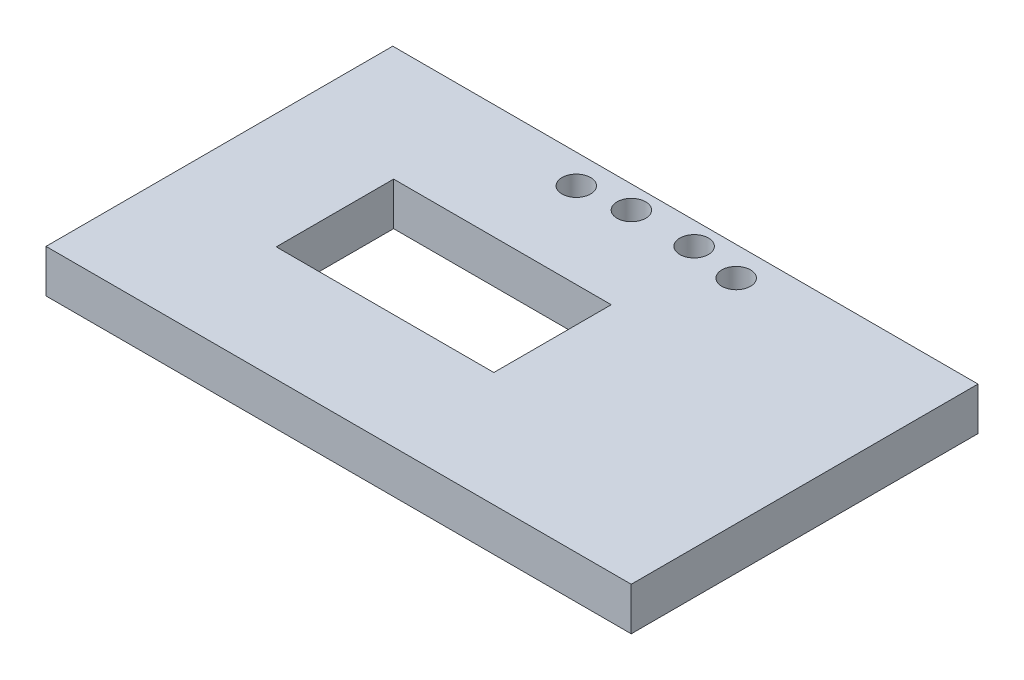
ISO-10303-21;
HEADER;
FILE_DESCRIPTION(('STEP AP214'),'2;1');
FILE_NAME('part.step','',(''),(''),'','','');
FILE_SCHEMA(('AUTOMOTIVE_DESIGN { 1 0 10303 214 1 1 1 1 }'));
ENDSEC;
DATA;
#1=APPLICATION_CONTEXT('core data for automotive mechanical design processes');
#2=APPLICATION_PROTOCOL_DEFINITION('international standard','automotive_design',2000,#1);
#3=PRODUCT_CONTEXT('',#1,'mechanical');
#4=PRODUCT('Part','Part','',(#3));
#5=PRODUCT_RELATED_PRODUCT_CATEGORY('part','',(#4));
#6=PRODUCT_DEFINITION_FORMATION('','',#4);
#7=PRODUCT_DEFINITION_CONTEXT('part definition',#1,'design');
#8=PRODUCT_DEFINITION('design','',#6,#7);
#9=PRODUCT_DEFINITION_SHAPE('','',#8);
#10=(LENGTH_UNIT() NAMED_UNIT(*) SI_UNIT(.MILLI.,.METRE.));
#11=(NAMED_UNIT(*) PLANE_ANGLE_UNIT() SI_UNIT($,.RADIAN.));
#12=(NAMED_UNIT(*) SI_UNIT($,.STERADIAN.) SOLID_ANGLE_UNIT());
#13=UNCERTAINTY_MEASURE_WITH_UNIT(LENGTH_MEASURE(1.E-05),#10,'distance_accuracy_value','');
#14=(GEOMETRIC_REPRESENTATION_CONTEXT(3) GLOBAL_UNCERTAINTY_ASSIGNED_CONTEXT((#13)) GLOBAL_UNIT_ASSIGNED_CONTEXT((#10,
#11,#12)) REPRESENTATION_CONTEXT('',''));
#15=CARTESIAN_POINT('',(0.,0.,0.));
#16=DIRECTION('',(0.,0.,1.));
#17=DIRECTION('',(1.,0.,0.));
#18=AXIS2_PLACEMENT_3D('',#15,#16,#17);
#19=CARTESIAN_POINT('',(0.,4.5,0.));
#20=DIRECTION('',(0.,-1.,0.));
#21=DIRECTION('',(0.,0.,-1.));
#22=AXIS2_PLACEMENT_3D('',#19,#20,#21);
#23=PLANE('',#22);
#24=CARTESIAN_POINT('',(-8.37556680298959,4.5,-15.1119633792668));
#25=DIRECTION('',(0.,1.,0.));
#26=DIRECTION('',(0.,0.,1.));
#27=AXIS2_PLACEMENT_3D('',#24,#25,#26);
#28=CIRCLE('',#27,1.5);
#29=CARTESIAN_POINT('',(-8.37556680298959,4.5,-13.6119633792668));
#30=VERTEX_POINT('',#29);
#31=EDGE_CURVE('E156',#30,#30,#28,.T.);
#32=ORIENTED_EDGE('',*,*,#31,.F.);
#33=EDGE_LOOP('',(#32));
#34=FACE_BOUND('',#33,.T.);
#35=DIRECTION('',(0.,0.,-1.));
#36=VECTOR('',#35,1.);
#37=CARTESIAN_POINT('',(30.6580366538147,4.5,18.1658847388471));
#38=LINE('',#37,#36);
#39=CARTESIAN_POINT('',(30.6580366538147,4.5,18.1658847388471));
#40=VERTEX_POINT('',#39);
#41=CARTESIAN_POINT('',(30.6580366538147,4.5,-18.1658847388471));
#42=VERTEX_POINT('',#41);
#43=EDGE_CURVE('E164',#40,#42,#38,.T.);
#44=ORIENTED_EDGE('',*,*,#43,.T.);
#45=DIRECTION('',(-1.,0.,0.));
#46=VECTOR('',#45,1.);
#47=CARTESIAN_POINT('',(-30.6580366538147,4.5,-18.1658847388471));
#48=LINE('',#47,#46);
#49=CARTESIAN_POINT('',(-30.6580366538147,4.5,-18.1658847388471));
#50=VERTEX_POINT('',#49);
#51=EDGE_CURVE('E168',#42,#50,#48,.T.);
#52=ORIENTED_EDGE('',*,*,#51,.T.);
#53=DIRECTION('',(0.,0.,1.));
#54=VECTOR('',#53,1.);
#55=CARTESIAN_POINT('',(-30.6580366538147,4.5,18.1658847388471));
#56=LINE('',#55,#54);
#57=CARTESIAN_POINT('',(-30.6580366538147,4.5,18.1658847388471));
#58=VERTEX_POINT('',#57);
#59=EDGE_CURVE('E172',#50,#58,#56,.T.);
#60=ORIENTED_EDGE('',*,*,#59,.T.);
#61=DIRECTION('',(1.,0.,0.));
#62=VECTOR('',#61,1.);
#63=CARTESIAN_POINT('',(-30.6580366538147,4.5,18.1658847388471));
#64=LINE('',#63,#62);
#65=EDGE_CURVE('E175',#58,#40,#64,.T.);
#66=ORIENTED_EDGE('',*,*,#65,.T.);
#67=EDGE_LOOP('',(#44,#52,#60,#66));
#68=FACE_BOUND('',#67,.T.);
#69=DIRECTION('',(0.,0.,1.));
#70=VECTOR('',#69,1.);
#71=CARTESIAN_POINT('',(-18.5521178849852,4.5,6.15));
#72=LINE('',#71,#70);
#73=CARTESIAN_POINT('',(-18.5521178849852,4.5,-6.15));
#74=VERTEX_POINT('',#73);
#75=CARTESIAN_POINT('',(-18.5521178849852,4.5,6.15));
#76=VERTEX_POINT('',#75);
#77=EDGE_CURVE('E105',#74,#76,#72,.T.);
#78=ORIENTED_EDGE('',*,*,#77,.F.);
#79=DIRECTION('',(-1.,0.,0.));
#80=VECTOR('',#79,1.);
#81=CARTESIAN_POINT('',(4.24788211501475,4.5,-6.15));
#82=LINE('',#81,#80);
#83=CARTESIAN_POINT('',(4.24788211501475,4.5,-6.15));
#84=VERTEX_POINT('',#83);
#85=EDGE_CURVE('E132',#84,#74,#82,.T.);
#86=ORIENTED_EDGE('',*,*,#85,.F.);
#87=DIRECTION('',(0.,0.,-1.));
#88=VECTOR('',#87,1.);
#89=CARTESIAN_POINT('',(4.24788211501476,4.5,6.15));
#90=LINE('',#89,#88);
#91=CARTESIAN_POINT('',(4.24788211501476,4.5,6.15));
#92=VERTEX_POINT('',#91);
#93=EDGE_CURVE('E128',#92,#84,#90,.T.);
#94=ORIENTED_EDGE('',*,*,#93,.F.);
#95=DIRECTION('',(1.,0.,0.));
#96=VECTOR('',#95,1.);
#97=CARTESIAN_POINT('',(4.24788211501476,4.5,6.15));
#98=LINE('',#97,#96);
#99=EDGE_CURVE('E114',#76,#92,#98,.T.);
#100=ORIENTED_EDGE('',*,*,#99,.F.);
#101=EDGE_LOOP('',(#78,#86,#94,#100));
#102=FACE_BOUND('',#101,.T.);
#103=CARTESIAN_POINT('',(-3.28811928008262,4.5,-15.7960495125027));
#104=DIRECTION('',(0.,1.,0.));
#105=DIRECTION('',(0.,0.,1.));
#106=AXIS2_PLACEMENT_3D('',#103,#104,#105);
#107=CIRCLE('',#106,1.5);
#108=CARTESIAN_POINT('',(-3.28811928008262,4.5,-14.2960495125027));
#109=VERTEX_POINT('',#108);
#110=EDGE_CURVE('E140',#109,#109,#107,.T.);
#111=ORIENTED_EDGE('',*,*,#110,.F.);
#112=EDGE_LOOP('',(#111));
#113=FACE_BOUND('',#112,.T.);
#114=CARTESIAN_POINT('',(3.28811928008262,4.5,-15.7960495125027));
#115=DIRECTION('',(0.,1.,0.));
#116=DIRECTION('',(0.,0.,-1.));
#117=AXIS2_PLACEMENT_3D('',#114,#115,#116);
#118=CIRCLE('',#117,1.5);
#119=CARTESIAN_POINT('',(3.28811928008262,4.5,-17.2960495125027));
#120=VERTEX_POINT('',#119);
#121=EDGE_CURVE('E288',#120,#120,#118,.T.);
#122=ORIENTED_EDGE('',*,*,#121,.F.);
#123=EDGE_LOOP('',(#122));
#124=FACE_BOUND('',#123,.T.);
#125=CARTESIAN_POINT('',(8.37556680298959,4.5,-15.1119633792668));
#126=DIRECTION('',(0.,1.,0.));
#127=DIRECTION('',(0.,0.,-1.));
#128=AXIS2_PLACEMENT_3D('',#125,#126,#127);
#129=CIRCLE('',#128,1.5);
#130=CARTESIAN_POINT('',(8.37556680298959,4.5,-16.6119633792668));
#131=VERTEX_POINT('',#130);
#132=EDGE_CURVE('E277',#131,#131,#129,.T.);
#133=ORIENTED_EDGE('',*,*,#132,.F.);
#134=EDGE_LOOP('',(#133));
#135=FACE_BOUND('',#134,.T.);
#136=ADVANCED_FACE('F39',(#34,#68,#102,#113,#124,#135),#23,.F.);
#137=CARTESIAN_POINT('',(0.,0.,0.));
#138=DIRECTION('',(0.,-1.,0.));
#139=DIRECTION('',(0.,0.,-1.));
#140=AXIS2_PLACEMENT_3D('',#137,#138,#139);
#141=PLANE('',#140);
#142=CARTESIAN_POINT('',(3.28811928008262,0.,-15.7960495125027));
#143=DIRECTION('',(0.,1.,0.));
#144=DIRECTION('',(0.,0.,-1.));
#145=AXIS2_PLACEMENT_3D('',#142,#143,#144);
#146=CIRCLE('',#145,1.5);
#147=CARTESIAN_POINT('',(3.28811928008262,0.,-17.2960495125027));
#148=VERTEX_POINT('',#147);
#149=EDGE_CURVE('E285',#148,#148,#146,.T.);
#150=ORIENTED_EDGE('',*,*,#149,.T.);
#151=EDGE_LOOP('',(#150));
#152=FACE_BOUND('',#151,.T.);
#153=DIRECTION('',(-1.,0.,0.));
#154=VECTOR('',#153,1.);
#155=CARTESIAN_POINT('',(4.24788211501475,0.,-6.15));
#156=LINE('',#155,#154);
#157=CARTESIAN_POINT('',(4.24788211501475,0.,-6.15));
#158=VERTEX_POINT('',#157);
#159=CARTESIAN_POINT('',(-18.5521178849852,0.,-6.15));
#160=VERTEX_POINT('',#159);
#161=EDGE_CURVE('E115',#158,#160,#156,.T.);
#162=ORIENTED_EDGE('',*,*,#161,.T.);
#163=DIRECTION('',(0.,0.,1.));
#164=VECTOR('',#163,1.);
#165=CARTESIAN_POINT('',(-18.5521178849852,0.,6.15));
#166=LINE('',#165,#164);
#167=CARTESIAN_POINT('',(-18.5521178849852,0.,6.15));
#168=VERTEX_POINT('',#167);
#169=EDGE_CURVE('E63',#160,#168,#166,.T.);
#170=ORIENTED_EDGE('',*,*,#169,.T.);
#171=DIRECTION('',(1.,0.,0.));
#172=VECTOR('',#171,1.);
#173=CARTESIAN_POINT('',(4.24788211501476,0.,6.15));
#174=LINE('',#173,#172);
#175=CARTESIAN_POINT('',(4.24788211501476,0.,6.15));
#176=VERTEX_POINT('',#175);
#177=EDGE_CURVE('E121',#168,#176,#174,.T.);
#178=ORIENTED_EDGE('',*,*,#177,.T.);
#179=DIRECTION('',(0.,0.,-1.));
#180=VECTOR('',#179,1.);
#181=CARTESIAN_POINT('',(4.24788211501476,0.,6.15));
#182=LINE('',#181,#180);
#183=EDGE_CURVE('E143',#176,#158,#182,.T.);
#184=ORIENTED_EDGE('',*,*,#183,.T.);
#185=EDGE_LOOP('',(#162,#170,#178,#184));
#186=FACE_BOUND('',#185,.T.);
#187=CARTESIAN_POINT('',(-8.37556680298959,0.,-15.1119633792668));
#188=DIRECTION('',(0.,1.,0.));
#189=DIRECTION('',(0.,0.,1.));
#190=AXIS2_PLACEMENT_3D('',#187,#188,#189);
#191=CIRCLE('',#190,1.5);
#192=CARTESIAN_POINT('',(-8.37556680298959,0.,-13.6119633792668));
#193=VERTEX_POINT('',#192);
#194=EDGE_CURVE('E123',#193,#193,#191,.T.);
#195=ORIENTED_EDGE('',*,*,#194,.T.);
#196=EDGE_LOOP('',(#195));
#197=FACE_BOUND('',#196,.T.);
#198=DIRECTION('',(0.,0.,-1.));
#199=VECTOR('',#198,1.);
#200=CARTESIAN_POINT('',(30.6580366538147,0.,18.1658847388471));
#201=LINE('',#200,#199);
#202=CARTESIAN_POINT('',(30.6580366538147,0.,18.1658847388471));
#203=VERTEX_POINT('',#202);
#204=CARTESIAN_POINT('',(30.6580366538147,0.,-18.1658847388471));
#205=VERTEX_POINT('',#204);
#206=EDGE_CURVE('E160',#203,#205,#201,.T.);
#207=ORIENTED_EDGE('',*,*,#206,.F.);
#208=DIRECTION('',(1.,0.,0.));
#209=VECTOR('',#208,1.);
#210=CARTESIAN_POINT('',(-30.6580366538147,0.,18.1658847388471));
#211=LINE('',#210,#209);
#212=CARTESIAN_POINT('',(-30.6580366538147,0.,18.1658847388471));
#213=VERTEX_POINT('',#212);
#214=EDGE_CURVE('E169',#213,#203,#211,.T.);
#215=ORIENTED_EDGE('',*,*,#214,.F.);
#216=DIRECTION('',(0.,0.,1.));
#217=VECTOR('',#216,1.);
#218=CARTESIAN_POINT('',(-30.6580366538147,0.,18.1658847388471));
#219=LINE('',#218,#217);
#220=CARTESIAN_POINT('',(-30.6580366538147,0.,-18.1658847388471));
#221=VERTEX_POINT('',#220);
#222=EDGE_CURVE('E185',#221,#213,#219,.T.);
#223=ORIENTED_EDGE('',*,*,#222,.F.);
#224=DIRECTION('',(-1.,0.,0.));
#225=VECTOR('',#224,1.);
#226=CARTESIAN_POINT('',(-30.6580366538147,0.,-18.1658847388471));
#227=LINE('',#226,#225);
#228=EDGE_CURVE('E182',#205,#221,#227,.T.);
#229=ORIENTED_EDGE('',*,*,#228,.F.);
#230=EDGE_LOOP('',(#207,#215,#223,#229));
#231=FACE_BOUND('',#230,.T.);
#232=CARTESIAN_POINT('',(-3.28811928008262,0.,-15.7960495125027));
#233=DIRECTION('',(0.,1.,0.));
#234=DIRECTION('',(0.,0.,1.));
#235=AXIS2_PLACEMENT_3D('',#232,#233,#234);
#236=CIRCLE('',#235,1.5);
#237=CARTESIAN_POINT('',(-3.28811928008262,0.,-14.2960495125027));
#238=VERTEX_POINT('',#237);
#239=EDGE_CURVE('E292',#238,#238,#236,.T.);
#240=ORIENTED_EDGE('',*,*,#239,.T.);
#241=EDGE_LOOP('',(#240));
#242=FACE_BOUND('',#241,.T.);
#243=CARTESIAN_POINT('',(8.37556680298959,0.,-15.1119633792668));
#244=DIRECTION('',(0.,1.,0.));
#245=DIRECTION('',(0.,0.,-1.));
#246=AXIS2_PLACEMENT_3D('',#243,#244,#245);
#247=CIRCLE('',#246,1.5);
#248=CARTESIAN_POINT('',(8.37556680298959,0.,-16.6119633792668));
#249=VERTEX_POINT('',#248);
#250=EDGE_CURVE('E280',#249,#249,#247,.T.);
#251=ORIENTED_EDGE('',*,*,#250,.T.);
#252=EDGE_LOOP('',(#251));
#253=FACE_BOUND('',#252,.T.);
#254=ADVANCED_FACE('F208',(#152,#186,#197,#231,#242,#253),#141,.T.);
#255=CARTESIAN_POINT('',(30.6580366538147,4.5,18.1658847388471));
#256=DIRECTION('',(-1.,0.,0.));
#257=DIRECTION('',(0.,0.,1.));
#258=AXIS2_PLACEMENT_3D('',#255,#256,#257);
#259=PLANE('',#258);
#260=ORIENTED_EDGE('',*,*,#206,.T.);
#261=DIRECTION('',(0.,-1.,0.));
#262=VECTOR('',#261,1.);
#263=CARTESIAN_POINT('',(30.6580366538147,4.5,-18.1658847388471));
#264=LINE('',#263,#262);
#265=EDGE_CURVE('E11',#42,#205,#264,.T.);
#266=ORIENTED_EDGE('',*,*,#265,.F.);
#267=ORIENTED_EDGE('',*,*,#43,.F.);
#268=DIRECTION('',(0.,-1.,0.));
#269=VECTOR('',#268,1.);
#270=CARTESIAN_POINT('',(30.6580366538147,4.5,18.1658847388471));
#271=LINE('',#270,#269);
#272=EDGE_CURVE('E178',#40,#203,#271,.T.);
#273=ORIENTED_EDGE('',*,*,#272,.T.);
#274=EDGE_LOOP('',(#260,#266,#267,#273));
#275=FACE_BOUND('',#274,.T.);
#276=ADVANCED_FACE('F41',(#275),#259,.F.);
#277=CARTESIAN_POINT('',(-30.6580366538147,4.5,-18.1658847388471));
#278=DIRECTION('',(0.,0.,1.));
#279=DIRECTION('',(1.,0.,0.));
#280=AXIS2_PLACEMENT_3D('',#277,#278,#279);
#281=PLANE('',#280);
#282=ORIENTED_EDGE('',*,*,#228,.T.);
#283=DIRECTION('',(0.,-1.,0.));
#284=VECTOR('',#283,1.);
#285=CARTESIAN_POINT('',(-30.6580366538147,4.5,-18.1658847388471));
#286=LINE('',#285,#284);
#287=EDGE_CURVE('E48',#50,#221,#286,.T.);
#288=ORIENTED_EDGE('',*,*,#287,.F.);
#289=ORIENTED_EDGE('',*,*,#51,.F.);
#290=ORIENTED_EDGE('',*,*,#265,.T.);
#291=EDGE_LOOP('',(#282,#288,#289,#290));
#292=FACE_BOUND('',#291,.T.);
#293=ADVANCED_FACE('F218',(#292),#281,.F.);
#294=CARTESIAN_POINT('',(-30.6580366538147,4.5,18.1658847388471));
#295=DIRECTION('',(1.,0.,0.));
#296=DIRECTION('',(0.,0.,-1.));
#297=AXIS2_PLACEMENT_3D('',#294,#295,#296);
#298=PLANE('',#297);
#299=ORIENTED_EDGE('',*,*,#222,.T.);
#300=DIRECTION('',(0.,-1.,0.));
#301=VECTOR('',#300,1.);
#302=CARTESIAN_POINT('',(-30.6580366538147,4.5,18.1658847388471));
#303=LINE('',#302,#301);
#304=EDGE_CURVE('E193',#58,#213,#303,.T.);
#305=ORIENTED_EDGE('',*,*,#304,.F.);
#306=ORIENTED_EDGE('',*,*,#59,.F.);
#307=ORIENTED_EDGE('',*,*,#287,.T.);
#308=EDGE_LOOP('',(#299,#305,#306,#307));
#309=FACE_BOUND('',#308,.T.);
#310=ADVANCED_FACE('F202',(#309),#298,.F.);
#311=CARTESIAN_POINT('',(-30.6580366538147,4.5,18.1658847388471));
#312=DIRECTION('',(0.,0.,-1.));
#313=DIRECTION('',(-1.,0.,0.));
#314=AXIS2_PLACEMENT_3D('',#311,#312,#313);
#315=PLANE('',#314);
#316=ORIENTED_EDGE('',*,*,#214,.T.);
#317=ORIENTED_EDGE('',*,*,#272,.F.);
#318=ORIENTED_EDGE('',*,*,#65,.F.);
#319=ORIENTED_EDGE('',*,*,#304,.T.);
#320=EDGE_LOOP('',(#316,#317,#318,#319));
#321=FACE_BOUND('',#320,.T.);
#322=ADVANCED_FACE('F212',(#321),#315,.F.);
#323=CARTESIAN_POINT('',(-8.37556680298959,4.5,-15.1119633792668));
#324=DIRECTION('',(0.,-1.,0.));
#325=DIRECTION('',(0.,0.,-1.));
#326=AXIS2_PLACEMENT_3D('',#323,#324,#325);
#327=CYLINDRICAL_SURFACE('',#326,1.5);
#328=ORIENTED_EDGE('',*,*,#31,.T.);
#329=EDGE_LOOP('',(#328));
#330=FACE_BOUND('',#329,.T.);
#331=ORIENTED_EDGE('',*,*,#194,.F.);
#332=EDGE_LOOP('',(#331));
#333=FACE_BOUND('',#332,.T.);
#334=ADVANCED_FACE('F235',(#330,#333),#327,.F.);
#335=CARTESIAN_POINT('',(-18.5521178849852,4.5,6.15));
#336=DIRECTION('',(1.,0.,0.));
#337=DIRECTION('',(0.,0.,-1.));
#338=AXIS2_PLACEMENT_3D('',#335,#336,#337);
#339=PLANE('',#338);
#340=ORIENTED_EDGE('',*,*,#169,.F.);
#341=DIRECTION('',(0.,-1.,0.));
#342=VECTOR('',#341,1.);
#343=CARTESIAN_POINT('',(-18.5521178849852,4.5,-6.15));
#344=LINE('',#343,#342);
#345=EDGE_CURVE('E109',#74,#160,#344,.T.);
#346=ORIENTED_EDGE('',*,*,#345,.F.);
#347=ORIENTED_EDGE('',*,*,#77,.T.);
#348=DIRECTION('',(0.,-1.,0.));
#349=VECTOR('',#348,1.);
#350=CARTESIAN_POINT('',(-18.5521178849852,4.5,6.15));
#351=LINE('',#350,#349);
#352=EDGE_CURVE('E108',#76,#168,#351,.T.);
#353=ORIENTED_EDGE('',*,*,#352,.T.);
#354=EDGE_LOOP('',(#340,#346,#347,#353));
#355=FACE_BOUND('',#354,.T.);
#356=ADVANCED_FACE('F107',(#355),#339,.T.);
#357=CARTESIAN_POINT('',(4.24788211501476,4.5,6.15));
#358=DIRECTION('',(0.,0.,-1.));
#359=DIRECTION('',(-1.,0.,0.));
#360=AXIS2_PLACEMENT_3D('',#357,#358,#359);
#361=PLANE('',#360);
#362=ORIENTED_EDGE('',*,*,#177,.F.);
#363=ORIENTED_EDGE('',*,*,#352,.F.);
#364=ORIENTED_EDGE('',*,*,#99,.T.);
#365=DIRECTION('',(0.,-1.,0.));
#366=VECTOR('',#365,1.);
#367=CARTESIAN_POINT('',(4.24788211501476,4.5,6.15));
#368=LINE('',#367,#366);
#369=EDGE_CURVE('E124',#92,#176,#368,.T.);
#370=ORIENTED_EDGE('',*,*,#369,.T.);
#371=EDGE_LOOP('',(#362,#363,#364,#370));
#372=FACE_BOUND('',#371,.T.);
#373=ADVANCED_FACE('F118',(#372),#361,.T.);
#374=CARTESIAN_POINT('',(4.24788211501476,4.5,6.15));
#375=DIRECTION('',(-1.,0.,0.));
#376=DIRECTION('',(0.,0.,1.));
#377=AXIS2_PLACEMENT_3D('',#374,#375,#376);
#378=PLANE('',#377);
#379=ORIENTED_EDGE('',*,*,#183,.F.);
#380=ORIENTED_EDGE('',*,*,#369,.F.);
#381=ORIENTED_EDGE('',*,*,#93,.T.);
#382=DIRECTION('',(0.,-1.,0.));
#383=VECTOR('',#382,1.);
#384=CARTESIAN_POINT('',(4.24788211501475,4.5,-6.15));
#385=LINE('',#384,#383);
#386=EDGE_CURVE('E55',#84,#158,#385,.T.);
#387=ORIENTED_EDGE('',*,*,#386,.T.);
#388=EDGE_LOOP('',(#379,#380,#381,#387));
#389=FACE_BOUND('',#388,.T.);
#390=ADVANCED_FACE('F252',(#389),#378,.T.);
#391=CARTESIAN_POINT('',(4.24788211501475,4.5,-6.15));
#392=DIRECTION('',(0.,0.,1.));
#393=DIRECTION('',(1.,0.,0.));
#394=AXIS2_PLACEMENT_3D('',#391,#392,#393);
#395=PLANE('',#394);
#396=ORIENTED_EDGE('',*,*,#161,.F.);
#397=ORIENTED_EDGE('',*,*,#386,.F.);
#398=ORIENTED_EDGE('',*,*,#85,.T.);
#399=ORIENTED_EDGE('',*,*,#345,.T.);
#400=EDGE_LOOP('',(#396,#397,#398,#399));
#401=FACE_BOUND('',#400,.T.);
#402=ADVANCED_FACE('F257',(#401),#395,.T.);
#403=CARTESIAN_POINT('',(-3.28811928008262,4.5,-15.7960495125027));
#404=DIRECTION('',(0.,-1.,0.));
#405=DIRECTION('',(0.,0.,-1.));
#406=AXIS2_PLACEMENT_3D('',#403,#404,#405);
#407=CYLINDRICAL_SURFACE('',#406,1.5);
#408=ORIENTED_EDGE('',*,*,#110,.T.);
#409=EDGE_LOOP('',(#408));
#410=FACE_BOUND('',#409,.T.);
#411=ORIENTED_EDGE('',*,*,#239,.F.);
#412=EDGE_LOOP('',(#411));
#413=FACE_BOUND('',#412,.T.);
#414=ADVANCED_FACE('F261',(#410,#413),#407,.F.);
#415=CARTESIAN_POINT('',(3.28811928008262,4.5,-15.7960495125027));
#416=DIRECTION('',(0.,-1.,0.));
#417=DIRECTION('',(0.,0.,-1.));
#418=AXIS2_PLACEMENT_3D('',#415,#416,#417);
#419=CYLINDRICAL_SURFACE('',#418,1.5);
#420=ORIENTED_EDGE('',*,*,#121,.T.);
#421=EDGE_LOOP('',(#420));
#422=FACE_BOUND('',#421,.T.);
#423=ORIENTED_EDGE('',*,*,#149,.F.);
#424=EDGE_LOOP('',(#423));
#425=FACE_BOUND('',#424,.T.);
#426=ADVANCED_FACE('F264',(#422,#425),#419,.F.);
#427=CARTESIAN_POINT('',(8.37556680298959,4.5,-15.1119633792668));
#428=DIRECTION('',(0.,-1.,0.));
#429=DIRECTION('',(0.,0.,-1.));
#430=AXIS2_PLACEMENT_3D('',#427,#428,#429);
#431=CYLINDRICAL_SURFACE('',#430,1.5);
#432=ORIENTED_EDGE('',*,*,#132,.T.);
#433=EDGE_LOOP('',(#432));
#434=FACE_BOUND('',#433,.T.);
#435=ORIENTED_EDGE('',*,*,#250,.F.);
#436=EDGE_LOOP('',(#435));
#437=FACE_BOUND('',#436,.T.);
#438=ADVANCED_FACE('F268',(#434,#437),#431,.F.);
#439=CLOSED_SHELL('',(#136,#254,#276,#293,#310,#322,#334,#356,#373,#390,#402,#414,#426,#438));
#440=MANIFOLD_SOLID_BREP('B2',#439);
#441=ADVANCED_BREP_SHAPE_REPRESENTATION('',(#18,#440),#14);
#442=SHAPE_DEFINITION_REPRESENTATION(#9,#441);
ENDSEC;
END-ISO-10303-21;
